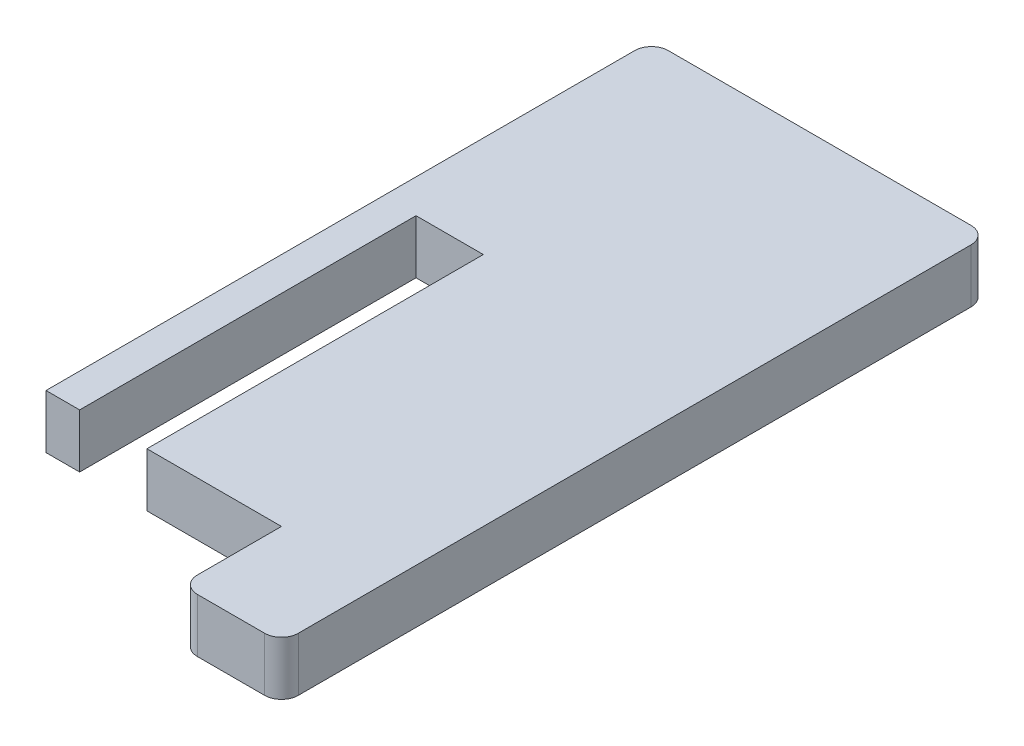
ISO-10303-21;
HEADER;
FILE_DESCRIPTION(('STEP AP214'),'2;1');
FILE_NAME('part.step','',(''),(''),'','','');
FILE_SCHEMA(('AUTOMOTIVE_DESIGN { 1 0 10303 214 1 1 1 1 }'));
ENDSEC;
DATA;
#1=APPLICATION_CONTEXT('core data for automotive mechanical design processes');
#2=APPLICATION_PROTOCOL_DEFINITION('international standard','automotive_design',2000,#1);
#3=PRODUCT_CONTEXT('',#1,'mechanical');
#4=PRODUCT('Part','Part','',(#3));
#5=PRODUCT_RELATED_PRODUCT_CATEGORY('part','',(#4));
#6=PRODUCT_DEFINITION_FORMATION('','',#4);
#7=PRODUCT_DEFINITION_CONTEXT('part definition',#1,'design');
#8=PRODUCT_DEFINITION('design','',#6,#7);
#9=PRODUCT_DEFINITION_SHAPE('','',#8);
#10=(LENGTH_UNIT() NAMED_UNIT(*) SI_UNIT(.MILLI.,.METRE.));
#11=(NAMED_UNIT(*) PLANE_ANGLE_UNIT() SI_UNIT($,.RADIAN.));
#12=(NAMED_UNIT(*) SI_UNIT($,.STERADIAN.) SOLID_ANGLE_UNIT());
#13=UNCERTAINTY_MEASURE_WITH_UNIT(LENGTH_MEASURE(1.E-05),#10,'distance_accuracy_value','');
#14=(GEOMETRIC_REPRESENTATION_CONTEXT(3) GLOBAL_UNCERTAINTY_ASSIGNED_CONTEXT((#13)) GLOBAL_UNIT_ASSIGNED_CONTEXT((#10,
#11,#12)) REPRESENTATION_CONTEXT('',''));
#15=CARTESIAN_POINT('',(0.,0.,0.));
#16=DIRECTION('',(0.,0.,1.));
#17=DIRECTION('',(1.,0.,0.));
#18=AXIS2_PLACEMENT_3D('',#15,#16,#17);
#19=CARTESIAN_POINT('',(606.412306420982,1.6,60.9484135564208));
#20=DIRECTION('',(0.,-1.,0.));
#21=DIRECTION('',(0.,0.,-1.));
#22=AXIS2_PLACEMENT_3D('',#19,#20,#21);
#23=CYLINDRICAL_SURFACE('',#22,0.500000000000028);
#24=CARTESIAN_POINT('',(606.412306420982,0.,60.9484135564208));
#25=DIRECTION('',(0.,1.,0.));
#26=DIRECTION('',(0.,0.,1.));
#27=AXIS2_PLACEMENT_3D('',#24,#25,#26);
#28=CIRCLE('',#27,0.500000000000028);
#29=CARTESIAN_POINT('',(605.912306420982,0.,60.9484135564208));
#30=VERTEX_POINT('',#29);
#31=CARTESIAN_POINT('',(606.412306420982,0.,61.4484135564208));
#32=VERTEX_POINT('',#31);
#33=EDGE_CURVE('E178',#30,#32,#28,.T.);
#34=ORIENTED_EDGE('',*,*,#33,.T.);
#35=DIRECTION('',(0.,-1.,0.));
#36=VECTOR('',#35,1.);
#37=CARTESIAN_POINT('',(606.412306420982,1.6,61.4484135564208));
#38=LINE('',#37,#36);
#39=CARTESIAN_POINT('',(606.412306420982,1.6,61.4484135564208));
#40=VERTEX_POINT('',#39);
#41=EDGE_CURVE('E11',#40,#32,#38,.T.);
#42=ORIENTED_EDGE('',*,*,#41,.F.);
#43=CARTESIAN_POINT('',(606.412306420982,1.6,60.9484135564208));
#44=DIRECTION('',(0.,1.,0.));
#45=DIRECTION('',(0.,0.,1.));
#46=AXIS2_PLACEMENT_3D('',#43,#44,#45);
#47=CIRCLE('',#46,0.500000000000028);
#48=CARTESIAN_POINT('',(605.912306420982,1.6,60.9484135564208));
#49=VERTEX_POINT('',#48);
#50=EDGE_CURVE('E219',#49,#40,#47,.T.);
#51=ORIENTED_EDGE('',*,*,#50,.F.);
#52=DIRECTION('',(0.,-1.,0.));
#53=VECTOR('',#52,1.);
#54=CARTESIAN_POINT('',(605.912306420982,1.6,60.9484135564208));
#55=LINE('',#54,#53);
#56=EDGE_CURVE('E174',#49,#30,#55,.T.);
#57=ORIENTED_EDGE('',*,*,#56,.T.);
#58=EDGE_LOOP('',(#34,#42,#51,#57));
#59=FACE_BOUND('',#58,.T.);
#60=ADVANCED_FACE('F41',(#59),#23,.T.);
#61=CARTESIAN_POINT('',(606.412306420982,1.6,61.4484135564208));
#62=DIRECTION('',(0.,0.,-1.));
#63=DIRECTION('',(-1.,0.,0.));
#64=AXIS2_PLACEMENT_3D('',#61,#62,#63);
#65=PLANE('',#64);
#66=DIRECTION('',(1.,0.,0.));
#67=VECTOR('',#66,1.);
#68=CARTESIAN_POINT('',(606.412306420982,0.,61.4484135564208));
#69=LINE('',#68,#67);
#70=CARTESIAN_POINT('',(608.412306420982,0.,61.4484135564208));
#71=VERTEX_POINT('',#70);
#72=EDGE_CURVE('E182',#32,#71,#69,.T.);
#73=ORIENTED_EDGE('',*,*,#72,.T.);
#74=DIRECTION('',(0.,-1.,0.));
#75=VECTOR('',#74,1.);
#76=CARTESIAN_POINT('',(608.412306420982,1.6,61.4484135564208));
#77=LINE('',#76,#75);
#78=CARTESIAN_POINT('',(608.412306420982,1.6,61.4484135564208));
#79=VERTEX_POINT('',#78);
#80=EDGE_CURVE('E50',#79,#71,#77,.T.);
#81=ORIENTED_EDGE('',*,*,#80,.F.);
#82=DIRECTION('',(1.,0.,0.));
#83=VECTOR('',#82,1.);
#84=CARTESIAN_POINT('',(606.412306420982,1.6,61.4484135564208));
#85=LINE('',#84,#83);
#86=EDGE_CURVE('E118',#40,#79,#85,.T.);
#87=ORIENTED_EDGE('',*,*,#86,.F.);
#88=ORIENTED_EDGE('',*,*,#41,.T.);
#89=EDGE_LOOP('',(#73,#81,#87,#88));
#90=FACE_BOUND('',#89,.T.);
#91=ADVANCED_FACE('F327',(#90),#65,.F.);
#92=CARTESIAN_POINT('',(608.412306420982,1.6,60.9484135564208));
#93=DIRECTION('',(0.,-1.,0.));
#94=DIRECTION('',(0.,0.,-1.));
#95=AXIS2_PLACEMENT_3D('',#92,#93,#94);
#96=CYLINDRICAL_SURFACE('',#95,0.499999999999973);
#97=CARTESIAN_POINT('',(608.412306420982,0.,60.9484135564208));
#98=DIRECTION('',(0.,1.,0.));
#99=DIRECTION('',(0.,0.,1.));
#100=AXIS2_PLACEMENT_3D('',#97,#98,#99);
#101=CIRCLE('',#100,0.499999999999973);
#102=CARTESIAN_POINT('',(608.912306420982,0.,60.9484135564208));
#103=VERTEX_POINT('',#102);
#104=EDGE_CURVE('E185',#71,#103,#101,.T.);
#105=ORIENTED_EDGE('',*,*,#104,.T.);
#106=DIRECTION('',(0.,-1.,0.));
#107=VECTOR('',#106,1.);
#108=CARTESIAN_POINT('',(608.912306420982,1.6,60.9484135564208));
#109=LINE('',#108,#107);
#110=CARTESIAN_POINT('',(608.912306420982,1.6,60.9484135564208));
#111=VERTEX_POINT('',#110);
#112=EDGE_CURVE('E254',#111,#103,#109,.T.);
#113=ORIENTED_EDGE('',*,*,#112,.F.);
#114=CARTESIAN_POINT('',(608.412306420982,1.6,60.9484135564208));
#115=DIRECTION('',(0.,1.,0.));
#116=DIRECTION('',(0.,0.,1.));
#117=AXIS2_PLACEMENT_3D('',#114,#115,#116);
#118=CIRCLE('',#117,0.499999999999973);
#119=EDGE_CURVE('E264',#79,#111,#118,.T.);
#120=ORIENTED_EDGE('',*,*,#119,.F.);
#121=ORIENTED_EDGE('',*,*,#80,.T.);
#122=EDGE_LOOP('',(#105,#113,#120,#121));
#123=FACE_BOUND('',#122,.T.);
#124=ADVANCED_FACE('F262',(#123),#96,.T.);
#125=CARTESIAN_POINT('',(608.912306420982,1.6,60.9484135564208));
#126=DIRECTION('',(-1.,0.,0.));
#127=DIRECTION('',(0.,0.,1.));
#128=AXIS2_PLACEMENT_3D('',#125,#126,#127);
#129=PLANE('',#128);
#130=DIRECTION('',(0.,0.,-1.));
#131=VECTOR('',#130,1.);
#132=CARTESIAN_POINT('',(608.912306420982,0.,60.9484135564208));
#133=LINE('',#132,#131);
#134=CARTESIAN_POINT('',(608.912306420982,0.,40.9484135564208));
#135=VERTEX_POINT('',#134);
#136=EDGE_CURVE('E188',#103,#135,#133,.T.);
#137=ORIENTED_EDGE('',*,*,#136,.T.);
#138=DIRECTION('',(0.,-1.,0.));
#139=VECTOR('',#138,1.);
#140=CARTESIAN_POINT('',(608.912306420982,1.6,40.9484135564208));
#141=LINE('',#140,#139);
#142=CARTESIAN_POINT('',(608.912306420982,1.6,40.9484135564208));
#143=VERTEX_POINT('',#142);
#144=EDGE_CURVE('E250',#143,#135,#141,.T.);
#145=ORIENTED_EDGE('',*,*,#144,.F.);
#146=DIRECTION('',(0.,0.,-1.));
#147=VECTOR('',#146,1.);
#148=CARTESIAN_POINT('',(608.912306420982,1.6,60.9484135564208));
#149=LINE('',#148,#147);
#150=EDGE_CURVE('E283',#111,#143,#149,.T.);
#151=ORIENTED_EDGE('',*,*,#150,.F.);
#152=ORIENTED_EDGE('',*,*,#112,.T.);
#153=EDGE_LOOP('',(#137,#145,#151,#152));
#154=FACE_BOUND('',#153,.T.);
#155=ADVANCED_FACE('F273',(#154),#129,.F.);
#156=CARTESIAN_POINT('',(608.412306420982,1.6,40.9484135564208));
#157=DIRECTION('',(0.,-1.,0.));
#158=DIRECTION('',(0.,0.,-1.));
#159=AXIS2_PLACEMENT_3D('',#156,#157,#158);
#160=CYLINDRICAL_SURFACE('',#159,0.499999999999973);
#161=CARTESIAN_POINT('',(608.412306420982,0.,40.9484135564208));
#162=DIRECTION('',(0.,1.,0.));
#163=DIRECTION('',(0.,0.,1.));
#164=AXIS2_PLACEMENT_3D('',#161,#162,#163);
#165=CIRCLE('',#164,0.499999999999973);
#166=CARTESIAN_POINT('',(608.412306420982,0.,40.4484135564208));
#167=VERTEX_POINT('',#166);
#168=EDGE_CURVE('E191',#135,#167,#165,.T.);
#169=ORIENTED_EDGE('',*,*,#168,.T.);
#170=DIRECTION('',(0.,-1.,0.));
#171=VECTOR('',#170,1.);
#172=CARTESIAN_POINT('',(608.412306420982,1.6,40.4484135564208));
#173=LINE('',#172,#171);
#174=CARTESIAN_POINT('',(608.412306420982,1.6,40.4484135564208));
#175=VERTEX_POINT('',#174);
#176=EDGE_CURVE('E246',#175,#167,#173,.T.);
#177=ORIENTED_EDGE('',*,*,#176,.F.);
#178=CARTESIAN_POINT('',(608.412306420982,1.6,40.9484135564208));
#179=DIRECTION('',(0.,1.,0.));
#180=DIRECTION('',(0.,0.,1.));
#181=AXIS2_PLACEMENT_3D('',#178,#179,#180);
#182=CIRCLE('',#181,0.499999999999973);
#183=EDGE_CURVE('E279',#143,#175,#182,.T.);
#184=ORIENTED_EDGE('',*,*,#183,.F.);
#185=ORIENTED_EDGE('',*,*,#144,.T.);
#186=EDGE_LOOP('',(#169,#177,#184,#185));
#187=FACE_BOUND('',#186,.T.);
#188=ADVANCED_FACE('F277',(#187),#160,.T.);
#189=CARTESIAN_POINT('',(599.412306420982,1.6,40.4484135564208));
#190=DIRECTION('',(0.,0.,1.));
#191=DIRECTION('',(1.,0.,0.));
#192=AXIS2_PLACEMENT_3D('',#189,#190,#191);
#193=PLANE('',#192);
#194=DIRECTION('',(-1.,0.,0.));
#195=VECTOR('',#194,1.);
#196=CARTESIAN_POINT('',(599.412306420982,0.,40.4484135564208));
#197=LINE('',#196,#195);
#198=CARTESIAN_POINT('',(599.412306420982,0.,40.4484135564208));
#199=VERTEX_POINT('',#198);
#200=EDGE_CURVE('E194',#167,#199,#197,.T.);
#201=ORIENTED_EDGE('',*,*,#200,.T.);
#202=DIRECTION('',(0.,-1.,0.));
#203=VECTOR('',#202,1.);
#204=CARTESIAN_POINT('',(599.412306420982,1.6,40.4484135564208));
#205=LINE('',#204,#203);
#206=CARTESIAN_POINT('',(599.412306420982,1.6,40.4484135564208));
#207=VERTEX_POINT('',#206);
#208=EDGE_CURVE('E242',#207,#199,#205,.T.);
#209=ORIENTED_EDGE('',*,*,#208,.F.);
#210=DIRECTION('',(-1.,0.,0.));
#211=VECTOR('',#210,1.);
#212=CARTESIAN_POINT('',(599.412306420982,1.6,40.4484135564208));
#213=LINE('',#212,#211);
#214=EDGE_CURVE('E282',#175,#207,#213,.T.);
#215=ORIENTED_EDGE('',*,*,#214,.F.);
#216=ORIENTED_EDGE('',*,*,#176,.T.);
#217=EDGE_LOOP('',(#201,#209,#215,#216));
#218=FACE_BOUND('',#217,.T.);
#219=ADVANCED_FACE('F340',(#218),#193,.F.);
#220=CARTESIAN_POINT('',(599.412306420982,1.6,40.9484135564208));
#221=DIRECTION('',(0.,-1.,0.));
#222=DIRECTION('',(0.,0.,-1.));
#223=AXIS2_PLACEMENT_3D('',#220,#221,#222);
#224=CYLINDRICAL_SURFACE('',#223,0.500000000000028);
#225=CARTESIAN_POINT('',(599.412306420982,0.,40.9484135564208));
#226=DIRECTION('',(0.,1.,0.));
#227=DIRECTION('',(0.,0.,1.));
#228=AXIS2_PLACEMENT_3D('',#225,#226,#227);
#229=CIRCLE('',#228,0.500000000000028);
#230=CARTESIAN_POINT('',(598.912306420982,0.,40.9484135564208));
#231=VERTEX_POINT('',#230);
#232=EDGE_CURVE('E197',#199,#231,#229,.T.);
#233=ORIENTED_EDGE('',*,*,#232,.T.);
#234=DIRECTION('',(0.,-1.,0.));
#235=VECTOR('',#234,1.);
#236=CARTESIAN_POINT('',(598.912306420982,1.6,40.9484135564208));
#237=LINE('',#236,#235);
#238=CARTESIAN_POINT('',(598.912306420982,1.6,40.9484135564208));
#239=VERTEX_POINT('',#238);
#240=EDGE_CURVE('E238',#239,#231,#237,.T.);
#241=ORIENTED_EDGE('',*,*,#240,.F.);
#242=CARTESIAN_POINT('',(599.412306420982,1.6,40.9484135564208));
#243=DIRECTION('',(0.,1.,0.));
#244=DIRECTION('',(0.,0.,1.));
#245=AXIS2_PLACEMENT_3D('',#242,#243,#244);
#246=CIRCLE('',#245,0.500000000000028);
#247=EDGE_CURVE('E287',#207,#239,#246,.T.);
#248=ORIENTED_EDGE('',*,*,#247,.F.);
#249=ORIENTED_EDGE('',*,*,#208,.T.);
#250=EDGE_LOOP('',(#233,#241,#248,#249));
#251=FACE_BOUND('',#250,.T.);
#252=ADVANCED_FACE('F343',(#251),#224,.T.);
#253=CARTESIAN_POINT('',(598.912306420982,1.6,58.4484135564208));
#254=DIRECTION('',(1.,0.,0.));
#255=DIRECTION('',(0.,0.,-1.));
#256=AXIS2_PLACEMENT_3D('',#253,#254,#255);
#257=PLANE('',#256);
#258=DIRECTION('',(0.,0.,1.));
#259=VECTOR('',#258,1.);
#260=CARTESIAN_POINT('',(598.912306420982,0.,58.4484135564208));
#261=LINE('',#260,#259);
#262=CARTESIAN_POINT('',(598.912306420982,0.,58.4484135564208));
#263=VERTEX_POINT('',#262);
#264=EDGE_CURVE('E200',#231,#263,#261,.T.);
#265=ORIENTED_EDGE('',*,*,#264,.T.);
#266=DIRECTION('',(0.,-1.,0.));
#267=VECTOR('',#266,1.);
#268=CARTESIAN_POINT('',(598.912306420982,1.6,58.4484135564208));
#269=LINE('',#268,#267);
#270=CARTESIAN_POINT('',(598.912306420982,1.6,58.4484135564208));
#271=VERTEX_POINT('',#270);
#272=EDGE_CURVE('E234',#271,#263,#269,.T.);
#273=ORIENTED_EDGE('',*,*,#272,.F.);
#274=DIRECTION('',(0.,0.,1.));
#275=VECTOR('',#274,1.);
#276=CARTESIAN_POINT('',(598.912306420982,1.6,58.4484135564208));
#277=LINE('',#276,#275);
#278=EDGE_CURVE('E294',#239,#271,#277,.T.);
#279=ORIENTED_EDGE('',*,*,#278,.F.);
#280=ORIENTED_EDGE('',*,*,#240,.T.);
#281=EDGE_LOOP('',(#265,#273,#279,#280));
#282=FACE_BOUND('',#281,.T.);
#283=ADVANCED_FACE('F347',(#282),#257,.F.);
#284=CARTESIAN_POINT('',(599.912306420982,1.6,58.4484135564208));
#285=DIRECTION('',(0.,0.,-1.));
#286=DIRECTION('',(-1.,0.,0.));
#287=AXIS2_PLACEMENT_3D('',#284,#285,#286);
#288=PLANE('',#287);
#289=DIRECTION('',(1.,0.,0.));
#290=VECTOR('',#289,1.);
#291=CARTESIAN_POINT('',(599.912306420982,0.,58.4484135564208));
#292=LINE('',#291,#290);
#293=CARTESIAN_POINT('',(599.912306420982,0.,58.4484135564208));
#294=VERTEX_POINT('',#293);
#295=EDGE_CURVE('E204',#263,#294,#292,.T.);
#296=ORIENTED_EDGE('',*,*,#295,.T.);
#297=DIRECTION('',(0.,-1.,0.));
#298=VECTOR('',#297,1.);
#299=CARTESIAN_POINT('',(599.912306420982,1.6,58.4484135564208));
#300=LINE('',#299,#298);
#301=CARTESIAN_POINT('',(599.912306420982,1.6,58.4484135564208));
#302=VERTEX_POINT('',#301);
#303=EDGE_CURVE('E230',#302,#294,#300,.T.);
#304=ORIENTED_EDGE('',*,*,#303,.F.);
#305=DIRECTION('',(1.,0.,0.));
#306=VECTOR('',#305,1.);
#307=CARTESIAN_POINT('',(598.912306420982,1.6,58.4484135564208));
#308=LINE('',#307,#306);
#309=EDGE_CURVE('E297',#271,#302,#308,.T.);
#310=ORIENTED_EDGE('',*,*,#309,.F.);
#311=ORIENTED_EDGE('',*,*,#272,.T.);
#312=EDGE_LOOP('',(#296,#304,#310,#311));
#313=FACE_BOUND('',#312,.T.);
#314=ADVANCED_FACE('F351',(#313),#288,.F.);
#315=CARTESIAN_POINT('',(599.912306420982,1.6,48.4484135564208));
#316=DIRECTION('',(-1.,0.,0.));
#317=DIRECTION('',(0.,0.,1.));
#318=AXIS2_PLACEMENT_3D('',#315,#316,#317);
#319=PLANE('',#318);
#320=DIRECTION('',(0.,0.,-1.));
#321=VECTOR('',#320,1.);
#322=CARTESIAN_POINT('',(599.912306420982,0.,48.4484135564208));
#323=LINE('',#322,#321);
#324=CARTESIAN_POINT('',(599.912306420982,0.,48.4484135564208));
#325=VERTEX_POINT('',#324);
#326=EDGE_CURVE('E207',#294,#325,#323,.T.);
#327=ORIENTED_EDGE('',*,*,#326,.T.);
#328=DIRECTION('',(0.,-1.,0.));
#329=VECTOR('',#328,1.);
#330=CARTESIAN_POINT('',(599.912306420982,1.6,48.4484135564208));
#331=LINE('',#330,#329);
#332=CARTESIAN_POINT('',(599.912306420982,1.6,48.4484135564208));
#333=VERTEX_POINT('',#332);
#334=EDGE_CURVE('E226',#333,#325,#331,.T.);
#335=ORIENTED_EDGE('',*,*,#334,.F.);
#336=DIRECTION('',(0.,0.,-1.));
#337=VECTOR('',#336,1.);
#338=CARTESIAN_POINT('',(599.912306420982,1.6,48.4484135564208));
#339=LINE('',#338,#337);
#340=EDGE_CURVE('E300',#302,#333,#339,.T.);
#341=ORIENTED_EDGE('',*,*,#340,.F.);
#342=ORIENTED_EDGE('',*,*,#303,.T.);
#343=EDGE_LOOP('',(#327,#335,#341,#342));
#344=FACE_BOUND('',#343,.T.);
#345=ADVANCED_FACE('F308',(#344),#319,.F.);
#346=CARTESIAN_POINT('',(601.912306420982,1.6,48.4484135564208));
#347=DIRECTION('',(0.,0.,-1.));
#348=DIRECTION('',(-1.,0.,0.));
#349=AXIS2_PLACEMENT_3D('',#346,#347,#348);
#350=PLANE('',#349);
#351=DIRECTION('',(1.,0.,0.));
#352=VECTOR('',#351,1.);
#353=CARTESIAN_POINT('',(601.912306420982,0.,48.4484135564208));
#354=LINE('',#353,#352);
#355=CARTESIAN_POINT('',(601.912306420982,0.,48.4484135564208));
#356=VERTEX_POINT('',#355);
#357=EDGE_CURVE('E210',#325,#356,#354,.T.);
#358=ORIENTED_EDGE('',*,*,#357,.T.);
#359=DIRECTION('',(0.,-1.,0.));
#360=VECTOR('',#359,1.);
#361=CARTESIAN_POINT('',(601.912306420982,1.6,48.4484135564208));
#362=LINE('',#361,#360);
#363=CARTESIAN_POINT('',(601.912306420982,1.6,48.4484135564208));
#364=VERTEX_POINT('',#363);
#365=EDGE_CURVE('E167',#364,#356,#362,.T.);
#366=ORIENTED_EDGE('',*,*,#365,.F.);
#367=DIRECTION('',(1.,0.,0.));
#368=VECTOR('',#367,1.);
#369=CARTESIAN_POINT('',(601.912306420982,1.6,48.4484135564208));
#370=LINE('',#369,#368);
#371=EDGE_CURVE('E155',#333,#364,#370,.T.);
#372=ORIENTED_EDGE('',*,*,#371,.F.);
#373=ORIENTED_EDGE('',*,*,#334,.T.);
#374=EDGE_LOOP('',(#358,#366,#372,#373));
#375=FACE_BOUND('',#374,.T.);
#376=ADVANCED_FACE('F312',(#375),#350,.F.);
#377=CARTESIAN_POINT('',(601.912306420982,1.6,48.4484135564208));
#378=DIRECTION('',(1.,0.,0.));
#379=DIRECTION('',(0.,0.,-1.));
#380=AXIS2_PLACEMENT_3D('',#377,#378,#379);
#381=PLANE('',#380);
#382=DIRECTION('',(0.,0.,1.));
#383=VECTOR('',#382,1.);
#384=CARTESIAN_POINT('',(601.912306420982,0.,48.4484135564208));
#385=LINE('',#384,#383);
#386=CARTESIAN_POINT('',(601.912306420982,0.,58.4484135564208));
#387=VERTEX_POINT('',#386);
#388=EDGE_CURVE('E165',#356,#387,#385,.T.);
#389=ORIENTED_EDGE('',*,*,#388,.T.);
#390=DIRECTION('',(0.,-1.,0.));
#391=VECTOR('',#390,1.);
#392=CARTESIAN_POINT('',(601.912306420982,1.6,58.4484135564208));
#393=LINE('',#392,#391);
#394=CARTESIAN_POINT('',(601.912306420982,1.6,58.4484135564208));
#395=VERTEX_POINT('',#394);
#396=EDGE_CURVE('E162',#395,#387,#393,.T.);
#397=ORIENTED_EDGE('',*,*,#396,.F.);
#398=DIRECTION('',(0.,0.,1.));
#399=VECTOR('',#398,1.);
#400=CARTESIAN_POINT('',(601.912306420982,1.6,48.4484135564208));
#401=LINE('',#400,#399);
#402=EDGE_CURVE('E149',#364,#395,#401,.T.);
#403=ORIENTED_EDGE('',*,*,#402,.F.);
#404=ORIENTED_EDGE('',*,*,#365,.T.);
#405=EDGE_LOOP('',(#389,#397,#403,#404));
#406=FACE_BOUND('',#405,.T.);
#407=ADVANCED_FACE('F163',(#406),#381,.F.);
#408=CARTESIAN_POINT('',(602.162306420982,1.6,58.4484135564208));
#409=DIRECTION('',(0.,0.,-1.));
#410=DIRECTION('',(-1.,0.,0.));
#411=AXIS2_PLACEMENT_3D('',#408,#409,#410);
#412=PLANE('',#411);
#413=DIRECTION('',(1.,0.,0.));
#414=VECTOR('',#413,1.);
#415=CARTESIAN_POINT('',(602.162306420982,0.,58.4484135564208));
#416=LINE('',#415,#414);
#417=CARTESIAN_POINT('',(605.912306420982,0.,58.4484135564208));
#418=VERTEX_POINT('',#417);
#419=EDGE_CURVE('E104',#387,#418,#416,.T.);
#420=ORIENTED_EDGE('',*,*,#419,.T.);
#421=DIRECTION('',(0.,-1.,0.));
#422=VECTOR('',#421,1.);
#423=CARTESIAN_POINT('',(605.912306420982,1.6,58.4484135564208));
#424=LINE('',#423,#422);
#425=CARTESIAN_POINT('',(605.912306420982,1.6,58.4484135564208));
#426=VERTEX_POINT('',#425);
#427=EDGE_CURVE('E168',#426,#418,#424,.T.);
#428=ORIENTED_EDGE('',*,*,#427,.F.);
#429=DIRECTION('',(1.,0.,0.));
#430=VECTOR('',#429,1.);
#431=CARTESIAN_POINT('',(601.912306420982,1.6,58.4484135564208));
#432=LINE('',#431,#430);
#433=EDGE_CURVE('E153',#395,#426,#432,.T.);
#434=ORIENTED_EDGE('',*,*,#433,.F.);
#435=ORIENTED_EDGE('',*,*,#396,.T.);
#436=EDGE_LOOP('',(#420,#428,#434,#435));
#437=FACE_BOUND('',#436,.T.);
#438=ADVANCED_FACE('F170',(#437),#412,.F.);
#439=CARTESIAN_POINT('',(605.912306420982,1.6,60.9484135564208));
#440=DIRECTION('',(1.,0.,0.));
#441=DIRECTION('',(0.,0.,-1.));
#442=AXIS2_PLACEMENT_3D('',#439,#440,#441);
#443=PLANE('',#442);
#444=DIRECTION('',(0.,0.,1.));
#445=VECTOR('',#444,1.);
#446=CARTESIAN_POINT('',(605.912306420982,0.,60.9484135564208));
#447=LINE('',#446,#445);
#448=EDGE_CURVE('E110',#418,#30,#447,.T.);
#449=ORIENTED_EDGE('',*,*,#448,.T.);
#450=ORIENTED_EDGE('',*,*,#56,.F.);
#451=DIRECTION('',(0.,0.,1.));
#452=VECTOR('',#451,1.);
#453=CARTESIAN_POINT('',(605.912306420982,1.6,60.9484135564208));
#454=LINE('',#453,#452);
#455=EDGE_CURVE('E58',#426,#49,#454,.T.);
#456=ORIENTED_EDGE('',*,*,#455,.F.);
#457=ORIENTED_EDGE('',*,*,#427,.T.);
#458=EDGE_LOOP('',(#449,#450,#456,#457));
#459=FACE_BOUND('',#458,.T.);
#460=ADVANCED_FACE('F316',(#459),#443,.F.);
#461=CARTESIAN_POINT('',(606.412306420982,1.6,60.9484135564208));
#462=DIRECTION('',(0.,1.,0.));
#463=DIRECTION('',(0.,0.,1.));
#464=AXIS2_PLACEMENT_3D('',#461,#462,#463);
#465=PLANE('',#464);
#466=ORIENTED_EDGE('',*,*,#50,.T.);
#467=ORIENTED_EDGE('',*,*,#86,.T.);
#468=ORIENTED_EDGE('',*,*,#119,.T.);
#469=ORIENTED_EDGE('',*,*,#150,.T.);
#470=ORIENTED_EDGE('',*,*,#183,.T.);
#471=ORIENTED_EDGE('',*,*,#214,.T.);
#472=ORIENTED_EDGE('',*,*,#247,.T.);
#473=ORIENTED_EDGE('',*,*,#278,.T.);
#474=ORIENTED_EDGE('',*,*,#309,.T.);
#475=ORIENTED_EDGE('',*,*,#340,.T.);
#476=ORIENTED_EDGE('',*,*,#371,.T.);
#477=ORIENTED_EDGE('',*,*,#402,.T.);
#478=ORIENTED_EDGE('',*,*,#433,.T.);
#479=ORIENTED_EDGE('',*,*,#455,.T.);
#480=EDGE_LOOP('',(#466,#467,#468,#469,#470,#471,#472,#473,#474,#475,#476,#477,#478,#479));
#481=FACE_BOUND('',#480,.T.);
#482=ADVANCED_FACE('F151',(#481),#465,.T.);
#483=CARTESIAN_POINT('',(606.412306420982,0.,60.9484135564208));
#484=DIRECTION('',(0.,1.,0.));
#485=DIRECTION('',(0.,0.,1.));
#486=AXIS2_PLACEMENT_3D('',#483,#484,#485);
#487=PLANE('',#486);
#488=ORIENTED_EDGE('',*,*,#33,.F.);
#489=ORIENTED_EDGE('',*,*,#448,.F.);
#490=ORIENTED_EDGE('',*,*,#419,.F.);
#491=ORIENTED_EDGE('',*,*,#388,.F.);
#492=ORIENTED_EDGE('',*,*,#357,.F.);
#493=ORIENTED_EDGE('',*,*,#326,.F.);
#494=ORIENTED_EDGE('',*,*,#295,.F.);
#495=ORIENTED_EDGE('',*,*,#264,.F.);
#496=ORIENTED_EDGE('',*,*,#232,.F.);
#497=ORIENTED_EDGE('',*,*,#200,.F.);
#498=ORIENTED_EDGE('',*,*,#168,.F.);
#499=ORIENTED_EDGE('',*,*,#136,.F.);
#500=ORIENTED_EDGE('',*,*,#104,.F.);
#501=ORIENTED_EDGE('',*,*,#72,.F.);
#502=EDGE_LOOP('',(#488,#489,#490,#491,#492,#493,#494,#495,#496,#497,#498,#499,#500,#501));
#503=FACE_BOUND('',#502,.T.);
#504=ADVANCED_FACE('F268',(#503),#487,.F.);
#505=CLOSED_SHELL('',(#60,#91,#124,#155,#188,#219,#252,#283,#314,#345,#376,#407,#438,#460,#482,#504));
#506=MANIFOLD_SOLID_BREP('B2',#505);
#507=ADVANCED_BREP_SHAPE_REPRESENTATION('',(#18,#506),#14);
#508=SHAPE_DEFINITION_REPRESENTATION(#9,#507);
ENDSEC;
END-ISO-10303-21;
